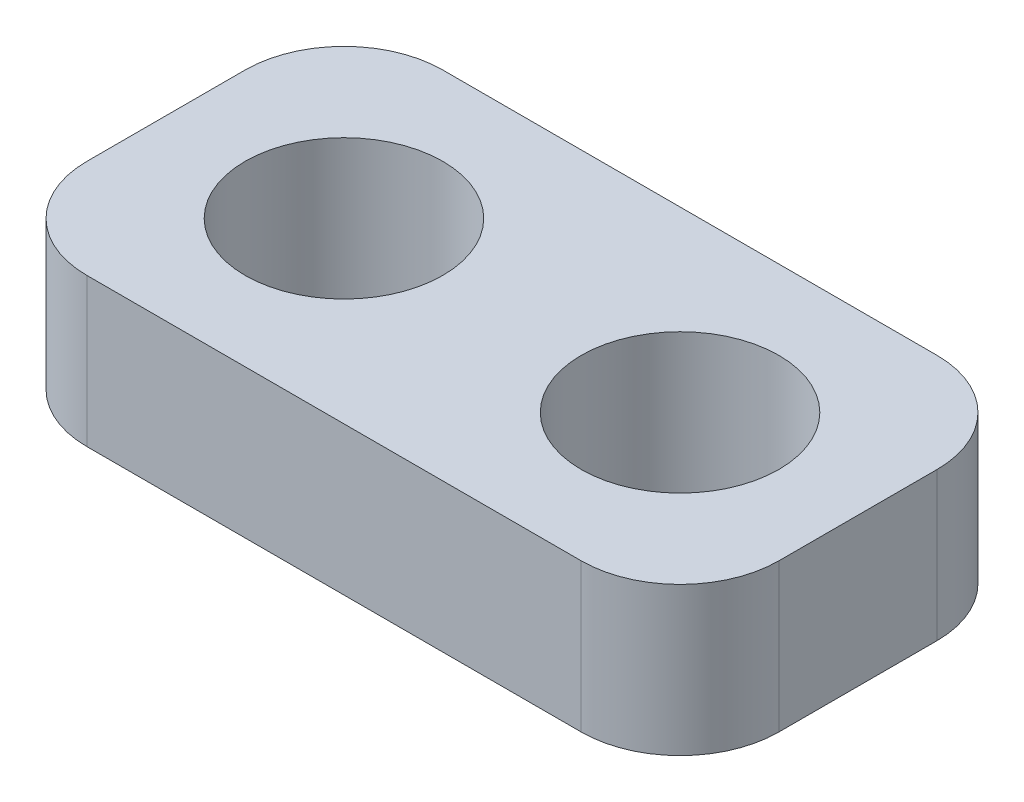
ISO-10303-21;
HEADER;
FILE_DESCRIPTION(('STEP AP214'),'2;1');
FILE_NAME('part.step','',(''),(''),'','','');
FILE_SCHEMA(('AUTOMOTIVE_DESIGN { 1 0 10303 214 1 1 1 1 }'));
ENDSEC;
DATA;
#1=APPLICATION_CONTEXT('core data for automotive mechanical design processes');
#2=APPLICATION_PROTOCOL_DEFINITION('international standard','automotive_design',2000,#1);
#3=PRODUCT_CONTEXT('',#1,'mechanical');
#4=PRODUCT('Part','Part','',(#3));
#5=PRODUCT_RELATED_PRODUCT_CATEGORY('part','',(#4));
#6=PRODUCT_DEFINITION_FORMATION('','',#4);
#7=PRODUCT_DEFINITION_CONTEXT('part definition',#1,'design');
#8=PRODUCT_DEFINITION('design','',#6,#7);
#9=PRODUCT_DEFINITION_SHAPE('','',#8);
#10=(LENGTH_UNIT() NAMED_UNIT(*) SI_UNIT(.MILLI.,.METRE.));
#11=(NAMED_UNIT(*) PLANE_ANGLE_UNIT() SI_UNIT($,.RADIAN.));
#12=(NAMED_UNIT(*) SI_UNIT($,.STERADIAN.) SOLID_ANGLE_UNIT());
#13=UNCERTAINTY_MEASURE_WITH_UNIT(LENGTH_MEASURE(1.E-05),#10,'distance_accuracy_value','');
#14=(GEOMETRIC_REPRESENTATION_CONTEXT(3) GLOBAL_UNCERTAINTY_ASSIGNED_CONTEXT((#13)) GLOBAL_UNIT_ASSIGNED_CONTEXT((#10,
#11,#12)) REPRESENTATION_CONTEXT('',''));
#15=CARTESIAN_POINT('',(0.,0.,0.));
#16=DIRECTION('',(0.,0.,1.));
#17=DIRECTION('',(1.,0.,0.));
#18=AXIS2_PLACEMENT_3D('',#15,#16,#17);
#19=CARTESIAN_POINT('',(0.,15.,0.));
#20=DIRECTION('',(0.,1.,0.));
#21=DIRECTION('',(0.,0.,1.));
#22=AXIS2_PLACEMENT_3D('',#19,#20,#21);
#23=PLANE('',#22);
#24=CARTESIAN_POINT('',(0.,15.,0.));
#25=DIRECTION('',(0.,1.,0.));
#26=DIRECTION('',(0.,0.,1.));
#27=AXIS2_PLACEMENT_3D('',#24,#25,#26);
#28=CIRCLE('',#27,10.);
#29=CARTESIAN_POINT('',(0.,15.,10.));
#30=VERTEX_POINT('',#29);
#31=EDGE_CURVE('E164',#30,#30,#28,.T.);
#32=ORIENTED_EDGE('',*,*,#31,.F.);
#33=EDGE_LOOP('',(#32));
#34=FACE_BOUND('',#33,.T.);
#35=DIRECTION('',(-1.,0.,0.));
#36=VECTOR('',#35,1.);
#37=CARTESIAN_POINT('',(18.,15.,-18.));
#38=LINE('',#37,#36);
#39=CARTESIAN_POINT('',(8.,15.,-18.));
#40=VERTEX_POINT('',#39);
#41=CARTESIAN_POINT('',(-42.,15.,-18.));
#42=VERTEX_POINT('',#41);
#43=EDGE_CURVE('E171',#40,#42,#38,.T.);
#44=ORIENTED_EDGE('',*,*,#43,.T.);
#45=CARTESIAN_POINT('',(-42.,15.,-8.));
#46=DIRECTION('',(0.,1.,0.));
#47=DIRECTION('',(0.,0.,1.));
#48=AXIS2_PLACEMENT_3D('',#45,#46,#47);
#49=CIRCLE('',#48,10.);
#50=CARTESIAN_POINT('',(-52.,15.,-8.));
#51=VERTEX_POINT('',#50);
#52=EDGE_CURVE('E148',#42,#51,#49,.T.);
#53=ORIENTED_EDGE('',*,*,#52,.T.);
#54=DIRECTION('',(0.,0.,1.));
#55=VECTOR('',#54,1.);
#56=CARTESIAN_POINT('',(-52.,15.,-18.));
#57=LINE('',#56,#55);
#58=CARTESIAN_POINT('',(-52.,15.,8.));
#59=VERTEX_POINT('',#58);
#60=EDGE_CURVE('E119',#51,#59,#57,.T.);
#61=ORIENTED_EDGE('',*,*,#60,.T.);
#62=CARTESIAN_POINT('',(-42.,15.,8.));
#63=DIRECTION('',(0.,1.,0.));
#64=DIRECTION('',(0.,0.,1.));
#65=AXIS2_PLACEMENT_3D('',#62,#63,#64);
#66=CIRCLE('',#65,10.);
#67=CARTESIAN_POINT('',(-42.,15.,18.));
#68=VERTEX_POINT('',#67);
#69=EDGE_CURVE('E143',#59,#68,#66,.T.);
#70=ORIENTED_EDGE('',*,*,#69,.T.);
#71=DIRECTION('',(1.,0.,0.));
#72=VECTOR('',#71,1.);
#73=CARTESIAN_POINT('',(-52.,15.,18.));
#74=LINE('',#73,#72);
#75=CARTESIAN_POINT('',(8.,15.,18.));
#76=VERTEX_POINT('',#75);
#77=EDGE_CURVE('E126',#68,#76,#74,.T.);
#78=ORIENTED_EDGE('',*,*,#77,.T.);
#79=CARTESIAN_POINT('',(8.,15.,8.));
#80=DIRECTION('',(0.,1.,0.));
#81=DIRECTION('',(0.,0.,1.));
#82=AXIS2_PLACEMENT_3D('',#79,#80,#81);
#83=CIRCLE('',#82,10.);
#84=CARTESIAN_POINT('',(18.,15.,8.));
#85=VERTEX_POINT('',#84);
#86=EDGE_CURVE('E55',#76,#85,#83,.T.);
#87=ORIENTED_EDGE('',*,*,#86,.T.);
#88=DIRECTION('',(0.,0.,-1.));
#89=VECTOR('',#88,1.);
#90=CARTESIAN_POINT('',(18.,15.,18.));
#91=LINE('',#90,#89);
#92=CARTESIAN_POINT('',(18.,15.,-8.));
#93=VERTEX_POINT('',#92);
#94=EDGE_CURVE('E129',#85,#93,#91,.T.);
#95=ORIENTED_EDGE('',*,*,#94,.T.);
#96=CARTESIAN_POINT('',(8.,15.,-8.));
#97=DIRECTION('',(0.,1.,0.));
#98=DIRECTION('',(0.,0.,1.));
#99=AXIS2_PLACEMENT_3D('',#96,#97,#98);
#100=CIRCLE('',#99,10.);
#101=EDGE_CURVE('E146',#93,#40,#100,.T.);
#102=ORIENTED_EDGE('',*,*,#101,.T.);
#103=EDGE_LOOP('',(#44,#53,#61,#70,#78,#87,#95,#102));
#104=FACE_BOUND('',#103,.T.);
#105=CARTESIAN_POINT('',(-34.,15.,0.));
#106=DIRECTION('',(0.,1.,0.));
#107=DIRECTION('',(0.,0.,1.));
#108=AXIS2_PLACEMENT_3D('',#105,#106,#107);
#109=CIRCLE('',#108,10.);
#110=CARTESIAN_POINT('',(-34.,15.,10.));
#111=VERTEX_POINT('',#110);
#112=EDGE_CURVE('E176',#111,#111,#109,.T.);
#113=ORIENTED_EDGE('',*,*,#112,.F.);
#114=EDGE_LOOP('',(#113));
#115=FACE_BOUND('',#114,.T.);
#116=ADVANCED_FACE('F33',(#34,#104,#115),#23,.T.);
#117=CARTESIAN_POINT('',(0.,0.,0.));
#118=DIRECTION('',(0.,1.,0.));
#119=DIRECTION('',(0.,0.,1.));
#120=AXIS2_PLACEMENT_3D('',#117,#118,#119);
#121=PLANE('',#120);
#122=DIRECTION('',(0.,0.,1.));
#123=VECTOR('',#122,1.);
#124=CARTESIAN_POINT('',(-52.,0.,-18.));
#125=LINE('',#124,#123);
#126=CARTESIAN_POINT('',(-52.,0.,-8.));
#127=VERTEX_POINT('',#126);
#128=CARTESIAN_POINT('',(-52.,0.,8.));
#129=VERTEX_POINT('',#128);
#130=EDGE_CURVE('E116',#127,#129,#125,.T.);
#131=ORIENTED_EDGE('',*,*,#130,.F.);
#132=CARTESIAN_POINT('',(-42.,0.,-8.));
#133=DIRECTION('',(0.,1.,0.));
#134=DIRECTION('',(0.,0.,1.));
#135=AXIS2_PLACEMENT_3D('',#132,#133,#134);
#136=CIRCLE('',#135,10.);
#137=CARTESIAN_POINT('',(-42.,0.,-18.));
#138=VERTEX_POINT('',#137);
#139=EDGE_CURVE('E99',#127,#138,#136,.F.);
#140=ORIENTED_EDGE('',*,*,#139,.T.);
#141=DIRECTION('',(-1.,0.,0.));
#142=VECTOR('',#141,1.);
#143=CARTESIAN_POINT('',(18.,0.,-18.));
#144=LINE('',#143,#142);
#145=CARTESIAN_POINT('',(8.,0.,-18.));
#146=VERTEX_POINT('',#145);
#147=EDGE_CURVE('E127',#146,#138,#144,.T.);
#148=ORIENTED_EDGE('',*,*,#147,.F.);
#149=CARTESIAN_POINT('',(8.,0.,-8.));
#150=DIRECTION('',(0.,1.,0.));
#151=DIRECTION('',(0.,0.,1.));
#152=AXIS2_PLACEMENT_3D('',#149,#150,#151);
#153=CIRCLE('',#152,10.);
#154=CARTESIAN_POINT('',(18.,0.,-8.));
#155=VERTEX_POINT('',#154);
#156=EDGE_CURVE('E110',#146,#155,#153,.F.);
#157=ORIENTED_EDGE('',*,*,#156,.T.);
#158=DIRECTION('',(0.,0.,-1.));
#159=VECTOR('',#158,1.);
#160=CARTESIAN_POINT('',(18.,0.,18.));
#161=LINE('',#160,#159);
#162=CARTESIAN_POINT('',(18.,0.,8.));
#163=VERTEX_POINT('',#162);
#164=EDGE_CURVE('E131',#163,#155,#161,.T.);
#165=ORIENTED_EDGE('',*,*,#164,.F.);
#166=CARTESIAN_POINT('',(8.,0.,8.));
#167=DIRECTION('',(0.,1.,0.));
#168=DIRECTION('',(0.,0.,1.));
#169=AXIS2_PLACEMENT_3D('',#166,#167,#168);
#170=CIRCLE('',#169,10.);
#171=CARTESIAN_POINT('',(8.,0.,18.));
#172=VERTEX_POINT('',#171);
#173=EDGE_CURVE('E137',#163,#172,#170,.F.);
#174=ORIENTED_EDGE('',*,*,#173,.T.);
#175=DIRECTION('',(1.,0.,0.));
#176=VECTOR('',#175,1.);
#177=CARTESIAN_POINT('',(-52.,0.,18.));
#178=LINE('',#177,#176);
#179=CARTESIAN_POINT('',(-42.,0.,18.));
#180=VERTEX_POINT('',#179);
#181=EDGE_CURVE('E159',#180,#172,#178,.T.);
#182=ORIENTED_EDGE('',*,*,#181,.F.);
#183=CARTESIAN_POINT('',(-42.,0.,8.));
#184=DIRECTION('',(0.,1.,0.));
#185=DIRECTION('',(0.,0.,1.));
#186=AXIS2_PLACEMENT_3D('',#183,#184,#185);
#187=CIRCLE('',#186,10.);
#188=EDGE_CURVE('E120',#180,#129,#187,.F.);
#189=ORIENTED_EDGE('',*,*,#188,.T.);
#190=EDGE_LOOP('',(#131,#140,#148,#157,#165,#174,#182,#189));
#191=FACE_BOUND('',#190,.T.);
#192=CARTESIAN_POINT('',(0.,0.,0.));
#193=DIRECTION('',(0.,1.,0.));
#194=DIRECTION('',(0.,0.,1.));
#195=AXIS2_PLACEMENT_3D('',#192,#193,#194);
#196=CIRCLE('',#195,10.);
#197=CARTESIAN_POINT('',(0.,0.,10.));
#198=VERTEX_POINT('',#197);
#199=EDGE_CURVE('E167',#198,#198,#196,.T.);
#200=ORIENTED_EDGE('',*,*,#199,.T.);
#201=EDGE_LOOP('',(#200));
#202=FACE_BOUND('',#201,.T.);
#203=CARTESIAN_POINT('',(-34.,0.,0.));
#204=DIRECTION('',(0.,1.,0.));
#205=DIRECTION('',(0.,0.,1.));
#206=AXIS2_PLACEMENT_3D('',#203,#204,#205);
#207=CIRCLE('',#206,10.);
#208=CARTESIAN_POINT('',(-34.,0.,10.));
#209=VERTEX_POINT('',#208);
#210=EDGE_CURVE('E178',#209,#209,#207,.T.);
#211=ORIENTED_EDGE('',*,*,#210,.T.);
#212=EDGE_LOOP('',(#211));
#213=FACE_BOUND('',#212,.T.);
#214=ADVANCED_FACE('F123',(#191,#202,#213),#121,.F.);
#215=CARTESIAN_POINT('',(-52.,15.,18.));
#216=DIRECTION('',(0.,0.,-1.));
#217=DIRECTION('',(-1.,0.,0.));
#218=AXIS2_PLACEMENT_3D('',#215,#216,#217);
#219=PLANE('',#218);
#220=ORIENTED_EDGE('',*,*,#181,.T.);
#221=DIRECTION('',(0.,-1.,0.));
#222=VECTOR('',#221,1.);
#223=CARTESIAN_POINT('',(8.,15.,18.));
#224=LINE('',#223,#222);
#225=EDGE_CURVE('E11',#172,#76,#224,.F.);
#226=ORIENTED_EDGE('',*,*,#225,.T.);
#227=ORIENTED_EDGE('',*,*,#77,.F.);
#228=DIRECTION('',(0.,-1.,0.));
#229=VECTOR('',#228,1.);
#230=CARTESIAN_POINT('',(-42.,15.,18.));
#231=LINE('',#230,#229);
#232=EDGE_CURVE('E41',#68,#180,#231,.T.);
#233=ORIENTED_EDGE('',*,*,#232,.T.);
#234=EDGE_LOOP('',(#220,#226,#227,#233));
#235=FACE_BOUND('',#234,.T.);
#236=ADVANCED_FACE('F158',(#235),#219,.F.);
#237=CARTESIAN_POINT('',(18.,15.,18.));
#238=DIRECTION('',(-1.,0.,0.));
#239=DIRECTION('',(0.,0.,1.));
#240=AXIS2_PLACEMENT_3D('',#237,#238,#239);
#241=PLANE('',#240);
#242=ORIENTED_EDGE('',*,*,#164,.T.);
#243=DIRECTION('',(0.,-1.,0.));
#244=VECTOR('',#243,1.);
#245=CARTESIAN_POINT('',(18.,15.,-8.));
#246=LINE('',#245,#244);
#247=EDGE_CURVE('E48',#155,#93,#246,.F.);
#248=ORIENTED_EDGE('',*,*,#247,.T.);
#249=ORIENTED_EDGE('',*,*,#94,.F.);
#250=DIRECTION('',(0.,-1.,0.));
#251=VECTOR('',#250,1.);
#252=CARTESIAN_POINT('',(18.,15.,8.));
#253=LINE('',#252,#251);
#254=EDGE_CURVE('E150',#85,#163,#253,.T.);
#255=ORIENTED_EDGE('',*,*,#254,.T.);
#256=EDGE_LOOP('',(#242,#248,#249,#255));
#257=FACE_BOUND('',#256,.T.);
#258=ADVANCED_FACE('F204',(#257),#241,.F.);
#259=CARTESIAN_POINT('',(18.,15.,-18.));
#260=DIRECTION('',(0.,0.,1.));
#261=DIRECTION('',(1.,0.,0.));
#262=AXIS2_PLACEMENT_3D('',#259,#260,#261);
#263=PLANE('',#262);
#264=ORIENTED_EDGE('',*,*,#147,.T.);
#265=DIRECTION('',(0.,-1.,0.));
#266=VECTOR('',#265,1.);
#267=CARTESIAN_POINT('',(-42.,15.,-18.));
#268=LINE('',#267,#266);
#269=EDGE_CURVE('E104',#138,#42,#268,.F.);
#270=ORIENTED_EDGE('',*,*,#269,.T.);
#271=ORIENTED_EDGE('',*,*,#43,.F.);
#272=DIRECTION('',(0.,-1.,0.));
#273=VECTOR('',#272,1.);
#274=CARTESIAN_POINT('',(8.,15.,-18.));
#275=LINE('',#274,#273);
#276=EDGE_CURVE('E109',#40,#146,#275,.T.);
#277=ORIENTED_EDGE('',*,*,#276,.T.);
#278=EDGE_LOOP('',(#264,#270,#271,#277));
#279=FACE_BOUND('',#278,.T.);
#280=ADVANCED_FACE('F201',(#279),#263,.F.);
#281=CARTESIAN_POINT('',(-52.,15.,-18.));
#282=DIRECTION('',(1.,0.,0.));
#283=DIRECTION('',(0.,0.,-1.));
#284=AXIS2_PLACEMENT_3D('',#281,#282,#283);
#285=PLANE('',#284);
#286=ORIENTED_EDGE('',*,*,#60,.F.);
#287=DIRECTION('',(0.,-1.,0.));
#288=VECTOR('',#287,1.);
#289=CARTESIAN_POINT('',(-52.,15.,-8.));
#290=LINE('',#289,#288);
#291=EDGE_CURVE('E103',#51,#127,#290,.T.);
#292=ORIENTED_EDGE('',*,*,#291,.T.);
#293=ORIENTED_EDGE('',*,*,#130,.T.);
#294=DIRECTION('',(0.,-1.,0.));
#295=VECTOR('',#294,1.);
#296=CARTESIAN_POINT('',(-52.,15.,8.));
#297=LINE('',#296,#295);
#298=EDGE_CURVE('E121',#129,#59,#297,.F.);
#299=ORIENTED_EDGE('',*,*,#298,.T.);
#300=EDGE_LOOP('',(#286,#292,#293,#299));
#301=FACE_BOUND('',#300,.T.);
#302=ADVANCED_FACE('F115',(#301),#285,.F.);
#303=CARTESIAN_POINT('',(0.,15.,0.));
#304=DIRECTION('',(0.,-1.,0.));
#305=DIRECTION('',(0.,0.,-1.));
#306=AXIS2_PLACEMENT_3D('',#303,#304,#305);
#307=CYLINDRICAL_SURFACE('',#306,10.);
#308=ORIENTED_EDGE('',*,*,#31,.T.);
#309=EDGE_LOOP('',(#308));
#310=FACE_BOUND('',#309,.T.);
#311=ORIENTED_EDGE('',*,*,#199,.F.);
#312=EDGE_LOOP('',(#311));
#313=FACE_BOUND('',#312,.T.);
#314=ADVANCED_FACE('F196',(#310,#313),#307,.F.);
#315=CARTESIAN_POINT('',(-34.,15.,0.));
#316=DIRECTION('',(0.,-1.,0.));
#317=DIRECTION('',(0.,0.,-1.));
#318=AXIS2_PLACEMENT_3D('',#315,#316,#317);
#319=CYLINDRICAL_SURFACE('',#318,10.);
#320=ORIENTED_EDGE('',*,*,#112,.T.);
#321=EDGE_LOOP('',(#320));
#322=FACE_BOUND('',#321,.T.);
#323=ORIENTED_EDGE('',*,*,#210,.F.);
#324=EDGE_LOOP('',(#323));
#325=FACE_BOUND('',#324,.T.);
#326=ADVANCED_FACE('F184',(#322,#325),#319,.F.);
#327=CARTESIAN_POINT('',(-42.,15.,-8.));
#328=DIRECTION('',(0.,-1.,0.));
#329=DIRECTION('',(0.,0.,-1.));
#330=AXIS2_PLACEMENT_3D('',#327,#328,#329);
#331=CYLINDRICAL_SURFACE('',#330,10.);
#332=ORIENTED_EDGE('',*,*,#52,.F.);
#333=ORIENTED_EDGE('',*,*,#269,.F.);
#334=ORIENTED_EDGE('',*,*,#139,.F.);
#335=ORIENTED_EDGE('',*,*,#291,.F.);
#336=EDGE_LOOP('',(#332,#333,#334,#335));
#337=FACE_BOUND('',#336,.T.);
#338=ADVANCED_FACE('F102',(#337),#331,.T.);
#339=CARTESIAN_POINT('',(8.,15.,-8.));
#340=DIRECTION('',(0.,-1.,0.));
#341=DIRECTION('',(0.,0.,-1.));
#342=AXIS2_PLACEMENT_3D('',#339,#340,#341);
#343=CYLINDRICAL_SURFACE('',#342,10.);
#344=ORIENTED_EDGE('',*,*,#101,.F.);
#345=ORIENTED_EDGE('',*,*,#247,.F.);
#346=ORIENTED_EDGE('',*,*,#156,.F.);
#347=ORIENTED_EDGE('',*,*,#276,.F.);
#348=EDGE_LOOP('',(#344,#345,#346,#347));
#349=FACE_BOUND('',#348,.T.);
#350=ADVANCED_FACE('F212',(#349),#343,.T.);
#351=CARTESIAN_POINT('',(8.,15.,8.));
#352=DIRECTION('',(0.,-1.,0.));
#353=DIRECTION('',(0.,0.,-1.));
#354=AXIS2_PLACEMENT_3D('',#351,#352,#353);
#355=CYLINDRICAL_SURFACE('',#354,10.);
#356=ORIENTED_EDGE('',*,*,#86,.F.);
#357=ORIENTED_EDGE('',*,*,#225,.F.);
#358=ORIENTED_EDGE('',*,*,#173,.F.);
#359=ORIENTED_EDGE('',*,*,#254,.F.);
#360=EDGE_LOOP('',(#356,#357,#358,#359));
#361=FACE_BOUND('',#360,.T.);
#362=ADVANCED_FACE('F214',(#361),#355,.T.);
#363=CARTESIAN_POINT('',(-42.,15.,8.));
#364=DIRECTION('',(0.,-1.,0.));
#365=DIRECTION('',(0.,0.,-1.));
#366=AXIS2_PLACEMENT_3D('',#363,#364,#365);
#367=CYLINDRICAL_SURFACE('',#366,10.);
#368=ORIENTED_EDGE('',*,*,#69,.F.);
#369=ORIENTED_EDGE('',*,*,#298,.F.);
#370=ORIENTED_EDGE('',*,*,#188,.F.);
#371=ORIENTED_EDGE('',*,*,#232,.F.);
#372=EDGE_LOOP('',(#368,#369,#370,#371));
#373=FACE_BOUND('',#372,.T.);
#374=ADVANCED_FACE('F35',(#373),#367,.T.);
#375=CLOSED_SHELL('',(#116,#214,#236,#258,#280,#302,#314,#326,#338,#350,#362,#374));
#376=MANIFOLD_SOLID_BREP('B2',#375);
#377=ADVANCED_BREP_SHAPE_REPRESENTATION('',(#18,#376),#14);
#378=SHAPE_DEFINITION_REPRESENTATION(#9,#377);
ENDSEC;
END-ISO-10303-21;
